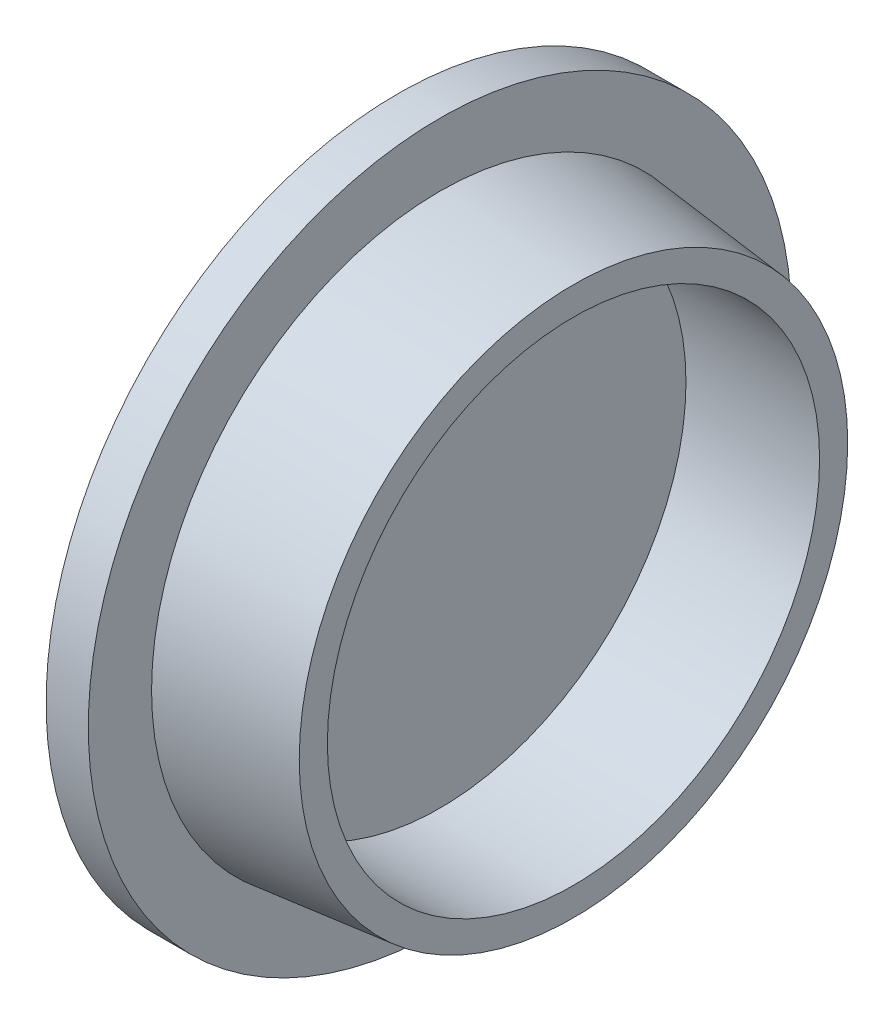
ISO-10303-21;
HEADER;
FILE_DESCRIPTION(('STEP AP214'),'2;1');
FILE_NAME('part.step','',(''),(''),'','','');
FILE_SCHEMA(('AUTOMOTIVE_DESIGN { 1 0 10303 214 1 1 1 1 }'));
ENDSEC;
DATA;
#1=APPLICATION_CONTEXT('core data for automotive mechanical design processes');
#2=APPLICATION_PROTOCOL_DEFINITION('international standard','automotive_design',2000,#1);
#3=PRODUCT_CONTEXT('',#1,'mechanical');
#4=PRODUCT('Part','Part','',(#3));
#5=PRODUCT_RELATED_PRODUCT_CATEGORY('part','',(#4));
#6=PRODUCT_DEFINITION_FORMATION('','',#4);
#7=PRODUCT_DEFINITION_CONTEXT('part definition',#1,'design');
#8=PRODUCT_DEFINITION('design','',#6,#7);
#9=PRODUCT_DEFINITION_SHAPE('','',#8);
#10=(LENGTH_UNIT() NAMED_UNIT(*) SI_UNIT(.MILLI.,.METRE.));
#11=(NAMED_UNIT(*) PLANE_ANGLE_UNIT() SI_UNIT($,.RADIAN.));
#12=(NAMED_UNIT(*) SI_UNIT($,.STERADIAN.) SOLID_ANGLE_UNIT());
#13=UNCERTAINTY_MEASURE_WITH_UNIT(LENGTH_MEASURE(1.E-05),#10,'distance_accuracy_value','');
#14=(GEOMETRIC_REPRESENTATION_CONTEXT(3) GLOBAL_UNCERTAINTY_ASSIGNED_CONTEXT((#13)) GLOBAL_UNIT_ASSIGNED_CONTEXT((#10,
#11,#12)) REPRESENTATION_CONTEXT('',''));
#15=CARTESIAN_POINT('',(0.,0.,0.));
#16=DIRECTION('',(0.,0.,1.));
#17=DIRECTION('',(1.,0.,0.));
#18=AXIS2_PLACEMENT_3D('',#15,#16,#17);
#19=CARTESIAN_POINT('',(-1.9,0.,0.));
#20=DIRECTION('',(1.,0.,0.));
#21=DIRECTION('',(0.,0.,-1.));
#22=AXIS2_PLACEMENT_3D('',#19,#20,#21);
#23=PLANE('',#22);
#24=CARTESIAN_POINT('',(-1.9,0.,0.));
#25=DIRECTION('',(1.,0.,0.));
#26=DIRECTION('',(0.,0.,-1.));
#27=AXIS2_PLACEMENT_3D('',#24,#25,#26);
#28=CIRCLE('',#27,3.5);
#29=CARTESIAN_POINT('',(-1.9,0.,-3.5));
#30=VERTEX_POINT('',#29);
#31=EDGE_CURVE('E10',#30,#30,#28,.T.);
#32=ORIENTED_EDGE('',*,*,#31,.T.);
#33=EDGE_LOOP('',(#32));
#34=FACE_BOUND('',#33,.T.);
#35=ADVANCED_FACE('F34',(#34),#23,.T.);
#36=CARTESIAN_POINT('',(-1.9,0.,0.));
#37=DIRECTION('',(1.,0.,0.));
#38=DIRECTION('',(0.,0.,-1.));
#39=AXIS2_PLACEMENT_3D('',#36,#37,#38);
#40=CYLINDRICAL_SURFACE('',#39,3.5);
#41=ORIENTED_EDGE('',*,*,#31,.F.);
#42=EDGE_LOOP('',(#41));
#43=FACE_BOUND('',#42,.T.);
#44=CARTESIAN_POINT('',(0.,0.,0.));
#45=DIRECTION('',(1.,0.,0.));
#46=DIRECTION('',(0.,0.,-1.));
#47=AXIS2_PLACEMENT_3D('',#44,#45,#46);
#48=CIRCLE('',#47,3.5);
#49=CARTESIAN_POINT('',(0.,0.,-3.5));
#50=VERTEX_POINT('',#49);
#51=EDGE_CURVE('E40',#50,#50,#48,.T.);
#52=ORIENTED_EDGE('',*,*,#51,.T.);
#53=EDGE_LOOP('',(#52));
#54=FACE_BOUND('',#53,.T.);
#55=ADVANCED_FACE('F72',(#43,#54),#40,.F.);
#56=CARTESIAN_POINT('',(0.,0.,0.));
#57=DIRECTION('',(-1.,0.,0.));
#58=DIRECTION('',(0.,0.,1.));
#59=AXIS2_PLACEMENT_3D('',#56,#57,#58);
#60=PLANE('',#59);
#61=ORIENTED_EDGE('',*,*,#51,.F.);
#62=EDGE_LOOP('',(#61));
#63=FACE_BOUND('',#62,.T.);
#64=CARTESIAN_POINT('',(0.,0.,0.));
#65=DIRECTION('',(1.,0.,0.));
#66=DIRECTION('',(0.,0.,-1.));
#67=AXIS2_PLACEMENT_3D('',#64,#65,#66);
#68=CIRCLE('',#67,3.9);
#69=CARTESIAN_POINT('',(0.,0.,-3.9));
#70=VERTEX_POINT('',#69);
#71=EDGE_CURVE('E44',#70,#70,#68,.T.);
#72=ORIENTED_EDGE('',*,*,#71,.T.);
#73=EDGE_LOOP('',(#72));
#74=FACE_BOUND('',#73,.T.);
#75=ADVANCED_FACE('F76',(#63,#74),#60,.F.);
#76=CARTESIAN_POINT('',(-1.9,0.,0.));
#77=DIRECTION('',(-1.,0.,0.));
#78=DIRECTION('',(0.,0.,1.));
#79=AXIS2_PLACEMENT_3D('',#76,#77,#78);
#80=CONICAL_SURFACE('',#79,4.1,0.104876938730234);
#81=ORIENTED_EDGE('',*,*,#71,.F.);
#82=EDGE_LOOP('',(#81));
#83=FACE_BOUND('',#82,.T.);
#84=CARTESIAN_POINT('',(-1.9,0.,0.));
#85=DIRECTION('',(1.,0.,0.));
#86=DIRECTION('',(0.,0.,-1.));
#87=AXIS2_PLACEMENT_3D('',#84,#85,#86);
#88=CIRCLE('',#87,4.1);
#89=CARTESIAN_POINT('',(-1.9,0.,-4.1));
#90=VERTEX_POINT('',#89);
#91=EDGE_CURVE('E48',#90,#90,#88,.T.);
#92=ORIENTED_EDGE('',*,*,#91,.T.);
#93=EDGE_LOOP('',(#92));
#94=FACE_BOUND('',#93,.T.);
#95=ADVANCED_FACE('F81',(#83,#94),#80,.T.);
#96=CARTESIAN_POINT('',(-1.9,0.,0.));
#97=DIRECTION('',(-1.,0.,0.));
#98=DIRECTION('',(0.,0.,1.));
#99=AXIS2_PLACEMENT_3D('',#96,#97,#98);
#100=PLANE('',#99);
#101=ORIENTED_EDGE('',*,*,#91,.F.);
#102=EDGE_LOOP('',(#101));
#103=FACE_BOUND('',#102,.T.);
#104=CARTESIAN_POINT('',(-1.9,0.,0.));
#105=DIRECTION('',(1.,0.,0.));
#106=DIRECTION('',(0.,0.,-1.));
#107=AXIS2_PLACEMENT_3D('',#104,#105,#106);
#108=CIRCLE('',#107,5.);
#109=CARTESIAN_POINT('',(-1.9,0.,-5.));
#110=VERTEX_POINT('',#109);
#111=EDGE_CURVE('E53',#110,#110,#108,.T.);
#112=ORIENTED_EDGE('',*,*,#111,.T.);
#113=EDGE_LOOP('',(#112));
#114=FACE_BOUND('',#113,.T.);
#115=ADVANCED_FACE('F68',(#103,#114),#100,.F.);
#116=CARTESIAN_POINT('',(-1.9,0.,0.));
#117=DIRECTION('',(1.,0.,0.));
#118=DIRECTION('',(0.,0.,-1.));
#119=AXIS2_PLACEMENT_3D('',#116,#117,#118);
#120=CYLINDRICAL_SURFACE('',#119,5.);
#121=ORIENTED_EDGE('',*,*,#111,.F.);
#122=EDGE_LOOP('',(#121));
#123=FACE_BOUND('',#122,.T.);
#124=CARTESIAN_POINT('',(-2.5,0.,0.));
#125=DIRECTION('',(1.,0.,0.));
#126=DIRECTION('',(0.,0.,-1.));
#127=AXIS2_PLACEMENT_3D('',#124,#125,#126);
#128=CIRCLE('',#127,5.);
#129=CARTESIAN_POINT('',(-2.5,0.,-5.));
#130=VERTEX_POINT('',#129);
#131=EDGE_CURVE('E56',#130,#130,#128,.T.);
#132=ORIENTED_EDGE('',*,*,#131,.T.);
#133=EDGE_LOOP('',(#132));
#134=FACE_BOUND('',#133,.T.);
#135=ADVANCED_FACE('F60',(#123,#134),#120,.T.);
#136=CARTESIAN_POINT('',(-2.5,0.,0.));
#137=DIRECTION('',(1.,0.,0.));
#138=DIRECTION('',(0.,0.,-1.));
#139=AXIS2_PLACEMENT_3D('',#136,#137,#138);
#140=PLANE('',#139);
#141=ORIENTED_EDGE('',*,*,#131,.F.);
#142=EDGE_LOOP('',(#141));
#143=FACE_BOUND('',#142,.T.);
#144=ADVANCED_FACE('F62',(#143),#140,.F.);
#145=CLOSED_SHELL('',(#35,#55,#75,#95,#115,#135,#144));
#146=MANIFOLD_SOLID_BREP('B2',#145);
#147=ADVANCED_BREP_SHAPE_REPRESENTATION('',(#18,#146),#14);
#148=SHAPE_DEFINITION_REPRESENTATION(#9,#147);
ENDSEC;
END-ISO-10303-21;
